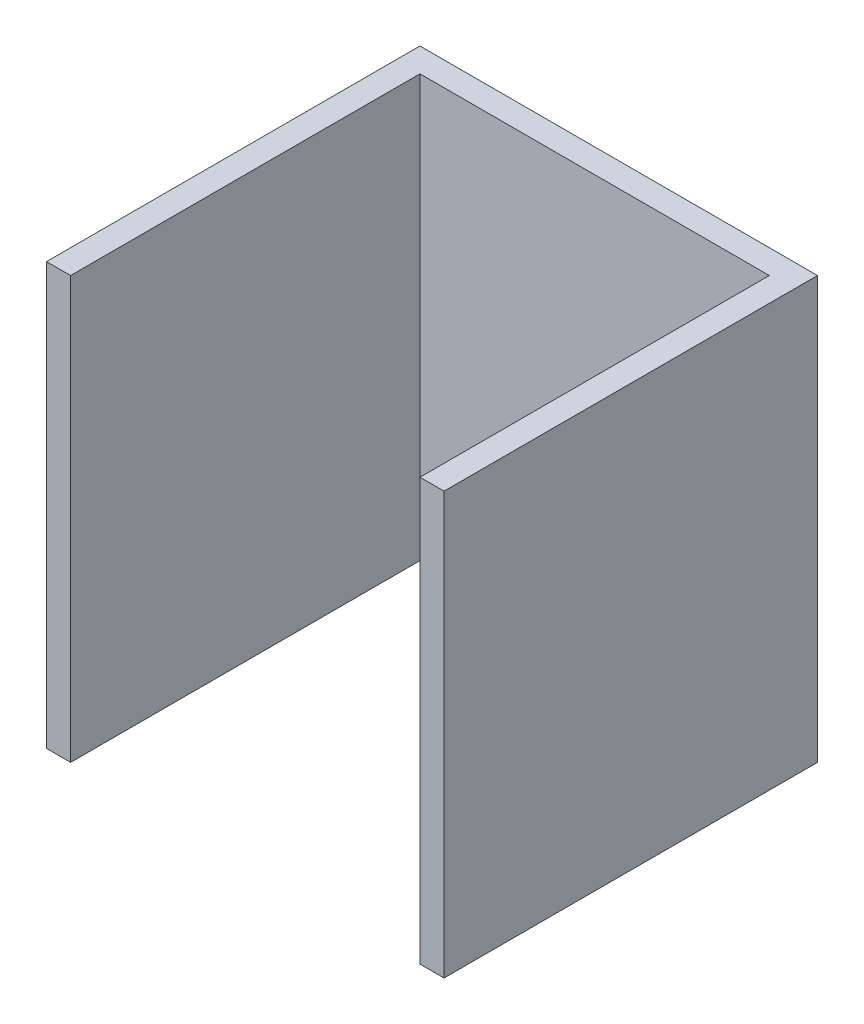
ISO-10303-21;
HEADER;
FILE_DESCRIPTION(('STEP AP214'),'2;1');
FILE_NAME('part.step','',(''),(''),'','','');
FILE_SCHEMA(('AUTOMOTIVE_DESIGN { 1 0 10303 214 1 1 1 1 }'));
ENDSEC;
DATA;
#1=APPLICATION_CONTEXT('core data for automotive mechanical design processes');
#2=APPLICATION_PROTOCOL_DEFINITION('international standard','automotive_design',2000,#1);
#3=PRODUCT_CONTEXT('',#1,'mechanical');
#4=PRODUCT('Part','Part','',(#3));
#5=PRODUCT_RELATED_PRODUCT_CATEGORY('part','',(#4));
#6=PRODUCT_DEFINITION_FORMATION('','',#4);
#7=PRODUCT_DEFINITION_CONTEXT('part definition',#1,'design');
#8=PRODUCT_DEFINITION('design','',#6,#7);
#9=PRODUCT_DEFINITION_SHAPE('','',#8);
#10=(LENGTH_UNIT() NAMED_UNIT(*) SI_UNIT(.MILLI.,.METRE.));
#11=(NAMED_UNIT(*) PLANE_ANGLE_UNIT() SI_UNIT($,.RADIAN.));
#12=(NAMED_UNIT(*) SI_UNIT($,.STERADIAN.) SOLID_ANGLE_UNIT());
#13=UNCERTAINTY_MEASURE_WITH_UNIT(LENGTH_MEASURE(1.E-05),#10,'distance_accuracy_value','');
#14=(GEOMETRIC_REPRESENTATION_CONTEXT(3) GLOBAL_UNCERTAINTY_ASSIGNED_CONTEXT((#13)) GLOBAL_UNIT_ASSIGNED_CONTEXT((#10,
#11,#12)) REPRESENTATION_CONTEXT('',''));
#15=CARTESIAN_POINT('',(0.,0.,0.));
#16=DIRECTION('',(0.,0.,1.));
#17=DIRECTION('',(1.,0.,0.));
#18=AXIS2_PLACEMENT_3D('',#15,#16,#17);
#19=CARTESIAN_POINT('',(-4.31003039513678,35.,-36.3010644112867));
#20=DIRECTION('',(1.,0.,0.));
#21=DIRECTION('',(0.,0.,-1.));
#22=AXIS2_PLACEMENT_3D('',#19,#20,#21);
#23=PLANE('',#22);
#24=DIRECTION('',(0.,0.,1.));
#25=VECTOR('',#24,1.);
#26=CARTESIAN_POINT('',(-4.31003039513678,0.,-36.3010644112867));
#27=LINE('',#26,#25);
#28=CARTESIAN_POINT('',(-4.31003039513678,0.,-36.3010644112867));
#29=VERTEX_POINT('',#28);
#30=CARTESIAN_POINT('',(-4.31003039513678,0.,-5.3010644112867));
#31=VERTEX_POINT('',#30);
#32=EDGE_CURVE('E144',#29,#31,#27,.T.);
#33=ORIENTED_EDGE('',*,*,#32,.T.);
#34=DIRECTION('',(0.,-1.,0.));
#35=VECTOR('',#34,1.);
#36=CARTESIAN_POINT('',(-4.31003039513678,35.,-5.3010644112867));
#37=LINE('',#36,#35);
#38=CARTESIAN_POINT('',(-4.31003039513678,35.,-5.3010644112867));
#39=VERTEX_POINT('',#38);
#40=EDGE_CURVE('E11',#39,#31,#37,.T.);
#41=ORIENTED_EDGE('',*,*,#40,.F.);
#42=DIRECTION('',(0.,0.,1.));
#43=VECTOR('',#42,1.);
#44=CARTESIAN_POINT('',(-4.31003039513678,35.,-36.3010644112867));
#45=LINE('',#44,#43);
#46=CARTESIAN_POINT('',(-4.31003039513678,35.,-36.3010644112867));
#47=VERTEX_POINT('',#46);
#48=EDGE_CURVE('E166',#47,#39,#45,.T.);
#49=ORIENTED_EDGE('',*,*,#48,.F.);
#50=DIRECTION('',(0.,-1.,0.));
#51=VECTOR('',#50,1.);
#52=CARTESIAN_POINT('',(-4.31003039513678,35.,-36.3010644112867));
#53=LINE('',#52,#51);
#54=EDGE_CURVE('E140',#47,#29,#53,.T.);
#55=ORIENTED_EDGE('',*,*,#54,.T.);
#56=EDGE_LOOP('',(#33,#41,#49,#55));
#57=FACE_BOUND('',#56,.T.);
#58=ADVANCED_FACE('F43',(#57),#23,.F.);
#59=CARTESIAN_POINT('',(-4.31003039513678,35.,-5.3010644112867));
#60=DIRECTION('',(0.,0.,-1.));
#61=DIRECTION('',(-1.,0.,0.));
#62=AXIS2_PLACEMENT_3D('',#59,#60,#61);
#63=PLANE('',#62);
#64=DIRECTION('',(1.,0.,0.));
#65=VECTOR('',#64,1.);
#66=CARTESIAN_POINT('',(-4.31003039513678,0.,-5.3010644112867));
#67=LINE('',#66,#65);
#68=CARTESIAN_POINT('',(-2.31003039513678,0.,-5.3010644112867));
#69=VERTEX_POINT('',#68);
#70=EDGE_CURVE('E148',#31,#69,#67,.T.);
#71=ORIENTED_EDGE('',*,*,#70,.T.);
#72=DIRECTION('',(0.,-1.,0.));
#73=VECTOR('',#72,1.);
#74=CARTESIAN_POINT('',(-2.31003039513678,35.,-5.3010644112867));
#75=LINE('',#74,#73);
#76=CARTESIAN_POINT('',(-2.31003039513678,35.,-5.3010644112867));
#77=VERTEX_POINT('',#76);
#78=EDGE_CURVE('E52',#77,#69,#75,.T.);
#79=ORIENTED_EDGE('',*,*,#78,.F.);
#80=DIRECTION('',(1.,0.,0.));
#81=VECTOR('',#80,1.);
#82=CARTESIAN_POINT('',(-4.31003039513678,35.,-5.3010644112867));
#83=LINE('',#82,#81);
#84=EDGE_CURVE('E103',#39,#77,#83,.T.);
#85=ORIENTED_EDGE('',*,*,#84,.F.);
#86=ORIENTED_EDGE('',*,*,#40,.T.);
#87=EDGE_LOOP('',(#71,#79,#85,#86));
#88=FACE_BOUND('',#87,.T.);
#89=ADVANCED_FACE('F212',(#88),#63,.F.);
#90=CARTESIAN_POINT('',(-2.31003039513678,35.,-5.3010644112867));
#91=DIRECTION('',(-1.,0.,0.));
#92=DIRECTION('',(0.,0.,1.));
#93=AXIS2_PLACEMENT_3D('',#90,#91,#92);
#94=PLANE('',#93);
#95=DIRECTION('',(0.,0.,-1.));
#96=VECTOR('',#95,1.);
#97=CARTESIAN_POINT('',(-2.31003039513678,0.,-5.3010644112867));
#98=LINE('',#97,#96);
#99=CARTESIAN_POINT('',(-2.31003039513678,0.,-34.3010644112867));
#100=VERTEX_POINT('',#99);
#101=EDGE_CURVE('E151',#69,#100,#98,.T.);
#102=ORIENTED_EDGE('',*,*,#101,.T.);
#103=DIRECTION('',(0.,-1.,0.));
#104=VECTOR('',#103,1.);
#105=CARTESIAN_POINT('',(-2.31003039513678,35.,-34.3010644112867));
#106=LINE('',#105,#104);
#107=CARTESIAN_POINT('',(-2.31003039513678,35.,-34.3010644112867));
#108=VERTEX_POINT('',#107);
#109=EDGE_CURVE('E177',#108,#100,#106,.T.);
#110=ORIENTED_EDGE('',*,*,#109,.F.);
#111=DIRECTION('',(0.,0.,-1.));
#112=VECTOR('',#111,1.);
#113=CARTESIAN_POINT('',(-2.31003039513678,35.,-5.3010644112867));
#114=LINE('',#113,#112);
#115=EDGE_CURVE('E187',#77,#108,#114,.T.);
#116=ORIENTED_EDGE('',*,*,#115,.F.);
#117=ORIENTED_EDGE('',*,*,#78,.T.);
#118=EDGE_LOOP('',(#102,#110,#116,#117));
#119=FACE_BOUND('',#118,.T.);
#120=ADVANCED_FACE('F185',(#119),#94,.F.);
#121=CARTESIAN_POINT('',(-2.31003039513678,35.,-34.3010644112867));
#122=DIRECTION('',(0.,0.,-1.));
#123=DIRECTION('',(-1.,0.,0.));
#124=AXIS2_PLACEMENT_3D('',#121,#122,#123);
#125=PLANE('',#124);
#126=DIRECTION('',(1.,0.,0.));
#127=VECTOR('',#126,1.);
#128=CARTESIAN_POINT('',(-2.31003039513678,0.,-34.3010644112867));
#129=LINE('',#128,#127);
#130=CARTESIAN_POINT('',(26.6899696048632,0.,-34.3010644112867));
#131=VERTEX_POINT('',#130);
#132=EDGE_CURVE('E154',#100,#131,#129,.T.);
#133=ORIENTED_EDGE('',*,*,#132,.T.);
#134=DIRECTION('',(0.,-1.,0.));
#135=VECTOR('',#134,1.);
#136=CARTESIAN_POINT('',(26.6899696048632,35.,-34.3010644112867));
#137=LINE('',#136,#135);
#138=CARTESIAN_POINT('',(26.6899696048632,35.,-34.3010644112867));
#139=VERTEX_POINT('',#138);
#140=EDGE_CURVE('E173',#139,#131,#137,.T.);
#141=ORIENTED_EDGE('',*,*,#140,.F.);
#142=DIRECTION('',(1.,0.,0.));
#143=VECTOR('',#142,1.);
#144=CARTESIAN_POINT('',(-2.31003039513678,35.,-34.3010644112867));
#145=LINE('',#144,#143);
#146=EDGE_CURVE('E200',#108,#139,#145,.T.);
#147=ORIENTED_EDGE('',*,*,#146,.F.);
#148=ORIENTED_EDGE('',*,*,#109,.T.);
#149=EDGE_LOOP('',(#133,#141,#147,#148));
#150=FACE_BOUND('',#149,.T.);
#151=ADVANCED_FACE('F195',(#150),#125,.F.);
#152=CARTESIAN_POINT('',(26.6899696048632,35.,-5.3010644112867));
#153=DIRECTION('',(1.,0.,0.));
#154=DIRECTION('',(0.,0.,-1.));
#155=AXIS2_PLACEMENT_3D('',#152,#153,#154);
#156=PLANE('',#155);
#157=DIRECTION('',(0.,0.,1.));
#158=VECTOR('',#157,1.);
#159=CARTESIAN_POINT('',(26.6899696048632,0.,-5.3010644112867));
#160=LINE('',#159,#158);
#161=CARTESIAN_POINT('',(26.6899696048632,0.,-5.3010644112867));
#162=VERTEX_POINT('',#161);
#163=EDGE_CURVE('E157',#131,#162,#160,.T.);
#164=ORIENTED_EDGE('',*,*,#163,.T.);
#165=DIRECTION('',(0.,-1.,0.));
#166=VECTOR('',#165,1.);
#167=CARTESIAN_POINT('',(26.6899696048632,35.,-5.3010644112867));
#168=LINE('',#167,#166);
#169=CARTESIAN_POINT('',(26.6899696048632,35.,-5.3010644112867));
#170=VERTEX_POINT('',#169);
#171=EDGE_CURVE('E133',#170,#162,#168,.T.);
#172=ORIENTED_EDGE('',*,*,#171,.F.);
#173=DIRECTION('',(0.,0.,1.));
#174=VECTOR('',#173,1.);
#175=CARTESIAN_POINT('',(26.6899696048632,35.,-5.3010644112867));
#176=LINE('',#175,#174);
#177=EDGE_CURVE('E122',#139,#170,#176,.T.);
#178=ORIENTED_EDGE('',*,*,#177,.F.);
#179=ORIENTED_EDGE('',*,*,#140,.T.);
#180=EDGE_LOOP('',(#164,#172,#178,#179));
#181=FACE_BOUND('',#180,.T.);
#182=ADVANCED_FACE('F198',(#181),#156,.F.);
#183=CARTESIAN_POINT('',(26.6899696048632,35.,-5.3010644112867));
#184=DIRECTION('',(0.,0.,-1.));
#185=DIRECTION('',(-1.,0.,0.));
#186=AXIS2_PLACEMENT_3D('',#183,#184,#185);
#187=PLANE('',#186);
#188=DIRECTION('',(1.,0.,0.));
#189=VECTOR('',#188,1.);
#190=CARTESIAN_POINT('',(26.6899696048632,0.,-5.3010644112867));
#191=LINE('',#190,#189);
#192=CARTESIAN_POINT('',(28.6899696048632,0.,-5.3010644112867));
#193=VERTEX_POINT('',#192);
#194=EDGE_CURVE('E131',#162,#193,#191,.T.);
#195=ORIENTED_EDGE('',*,*,#194,.T.);
#196=DIRECTION('',(0.,-1.,0.));
#197=VECTOR('',#196,1.);
#198=CARTESIAN_POINT('',(28.6899696048632,35.,-5.3010644112867));
#199=LINE('',#198,#197);
#200=CARTESIAN_POINT('',(28.6899696048632,35.,-5.3010644112867));
#201=VERTEX_POINT('',#200);
#202=EDGE_CURVE('E128',#201,#193,#199,.T.);
#203=ORIENTED_EDGE('',*,*,#202,.F.);
#204=DIRECTION('',(1.,0.,0.));
#205=VECTOR('',#204,1.);
#206=CARTESIAN_POINT('',(26.6899696048632,35.,-5.3010644112867));
#207=LINE('',#206,#205);
#208=EDGE_CURVE('E116',#170,#201,#207,.T.);
#209=ORIENTED_EDGE('',*,*,#208,.F.);
#210=ORIENTED_EDGE('',*,*,#171,.T.);
#211=EDGE_LOOP('',(#195,#203,#209,#210));
#212=FACE_BOUND('',#211,.T.);
#213=ADVANCED_FACE('F129',(#212),#187,.F.);
#214=CARTESIAN_POINT('',(28.6899696048632,35.,-36.3010644112867));
#215=DIRECTION('',(-1.,0.,0.));
#216=DIRECTION('',(0.,0.,1.));
#217=AXIS2_PLACEMENT_3D('',#214,#215,#216);
#218=PLANE('',#217);
#219=DIRECTION('',(0.,0.,-1.));
#220=VECTOR('',#219,1.);
#221=CARTESIAN_POINT('',(28.6899696048632,0.,-36.3010644112867));
#222=LINE('',#221,#220);
#223=CARTESIAN_POINT('',(28.6899696048632,0.,-36.3010644112867));
#224=VERTEX_POINT('',#223);
#225=EDGE_CURVE('E89',#193,#224,#222,.T.);
#226=ORIENTED_EDGE('',*,*,#225,.T.);
#227=DIRECTION('',(0.,-1.,0.));
#228=VECTOR('',#227,1.);
#229=CARTESIAN_POINT('',(28.6899696048632,35.,-36.3010644112867));
#230=LINE('',#229,#228);
#231=CARTESIAN_POINT('',(28.6899696048632,35.,-36.3010644112867));
#232=VERTEX_POINT('',#231);
#233=EDGE_CURVE('E134',#232,#224,#230,.T.);
#234=ORIENTED_EDGE('',*,*,#233,.F.);
#235=DIRECTION('',(0.,0.,-1.));
#236=VECTOR('',#235,1.);
#237=CARTESIAN_POINT('',(28.6899696048632,35.,-36.3010644112867));
#238=LINE('',#237,#236);
#239=EDGE_CURVE('E120',#201,#232,#238,.T.);
#240=ORIENTED_EDGE('',*,*,#239,.F.);
#241=ORIENTED_EDGE('',*,*,#202,.T.);
#242=EDGE_LOOP('',(#226,#234,#240,#241));
#243=FACE_BOUND('',#242,.T.);
#244=ADVANCED_FACE('F136',(#243),#218,.F.);
#245=CARTESIAN_POINT('',(-4.31003039513678,35.,-36.3010644112867));
#246=DIRECTION('',(0.,0.,1.));
#247=DIRECTION('',(1.,0.,0.));
#248=AXIS2_PLACEMENT_3D('',#245,#246,#247);
#249=PLANE('',#248);
#250=DIRECTION('',(-1.,0.,0.));
#251=VECTOR('',#250,1.);
#252=CARTESIAN_POINT('',(-4.31003039513678,0.,-36.3010644112867));
#253=LINE('',#252,#251);
#254=EDGE_CURVE('E95',#224,#29,#253,.T.);
#255=ORIENTED_EDGE('',*,*,#254,.T.);
#256=ORIENTED_EDGE('',*,*,#54,.F.);
#257=DIRECTION('',(-1.,0.,0.));
#258=VECTOR('',#257,1.);
#259=CARTESIAN_POINT('',(-4.31003039513678,35.,-36.3010644112867));
#260=LINE('',#259,#258);
#261=EDGE_CURVE('E60',#232,#47,#260,.T.);
#262=ORIENTED_EDGE('',*,*,#261,.F.);
#263=ORIENTED_EDGE('',*,*,#233,.T.);
#264=EDGE_LOOP('',(#255,#256,#262,#263));
#265=FACE_BOUND('',#264,.T.);
#266=ADVANCED_FACE('F228',(#265),#249,.F.);
#267=CARTESIAN_POINT('',(0.,35.,0.));
#268=DIRECTION('',(0.,1.,0.));
#269=DIRECTION('',(0.,0.,1.));
#270=AXIS2_PLACEMENT_3D('',#267,#268,#269);
#271=PLANE('',#270);
#272=ORIENTED_EDGE('',*,*,#48,.T.);
#273=ORIENTED_EDGE('',*,*,#84,.T.);
#274=ORIENTED_EDGE('',*,*,#115,.T.);
#275=ORIENTED_EDGE('',*,*,#146,.T.);
#276=ORIENTED_EDGE('',*,*,#177,.T.);
#277=ORIENTED_EDGE('',*,*,#208,.T.);
#278=ORIENTED_EDGE('',*,*,#239,.T.);
#279=ORIENTED_EDGE('',*,*,#261,.T.);
#280=EDGE_LOOP('',(#272,#273,#274,#275,#276,#277,#278,#279));
#281=FACE_BOUND('',#280,.T.);
#282=ADVANCED_FACE('F118',(#281),#271,.T.);
#283=CARTESIAN_POINT('',(0.,0.,0.));
#284=DIRECTION('',(0.,1.,0.));
#285=DIRECTION('',(0.,0.,1.));
#286=AXIS2_PLACEMENT_3D('',#283,#284,#285);
#287=PLANE('',#286);
#288=ORIENTED_EDGE('',*,*,#32,.F.);
#289=ORIENTED_EDGE('',*,*,#254,.F.);
#290=ORIENTED_EDGE('',*,*,#225,.F.);
#291=ORIENTED_EDGE('',*,*,#194,.F.);
#292=ORIENTED_EDGE('',*,*,#163,.F.);
#293=ORIENTED_EDGE('',*,*,#132,.F.);
#294=ORIENTED_EDGE('',*,*,#101,.F.);
#295=ORIENTED_EDGE('',*,*,#70,.F.);
#296=EDGE_LOOP('',(#288,#289,#290,#291,#292,#293,#294,#295));
#297=FACE_BOUND('',#296,.T.);
#298=ADVANCED_FACE('F191',(#297),#287,.F.);
#299=CLOSED_SHELL('',(#58,#89,#120,#151,#182,#213,#244,#266,#282,#298));
#300=MANIFOLD_SOLID_BREP('B2',#299);
#301=ADVANCED_BREP_SHAPE_REPRESENTATION('',(#18,#300),#14);
#302=SHAPE_DEFINITION_REPRESENTATION(#9,#301);
ENDSEC;
END-ISO-10303-21;
